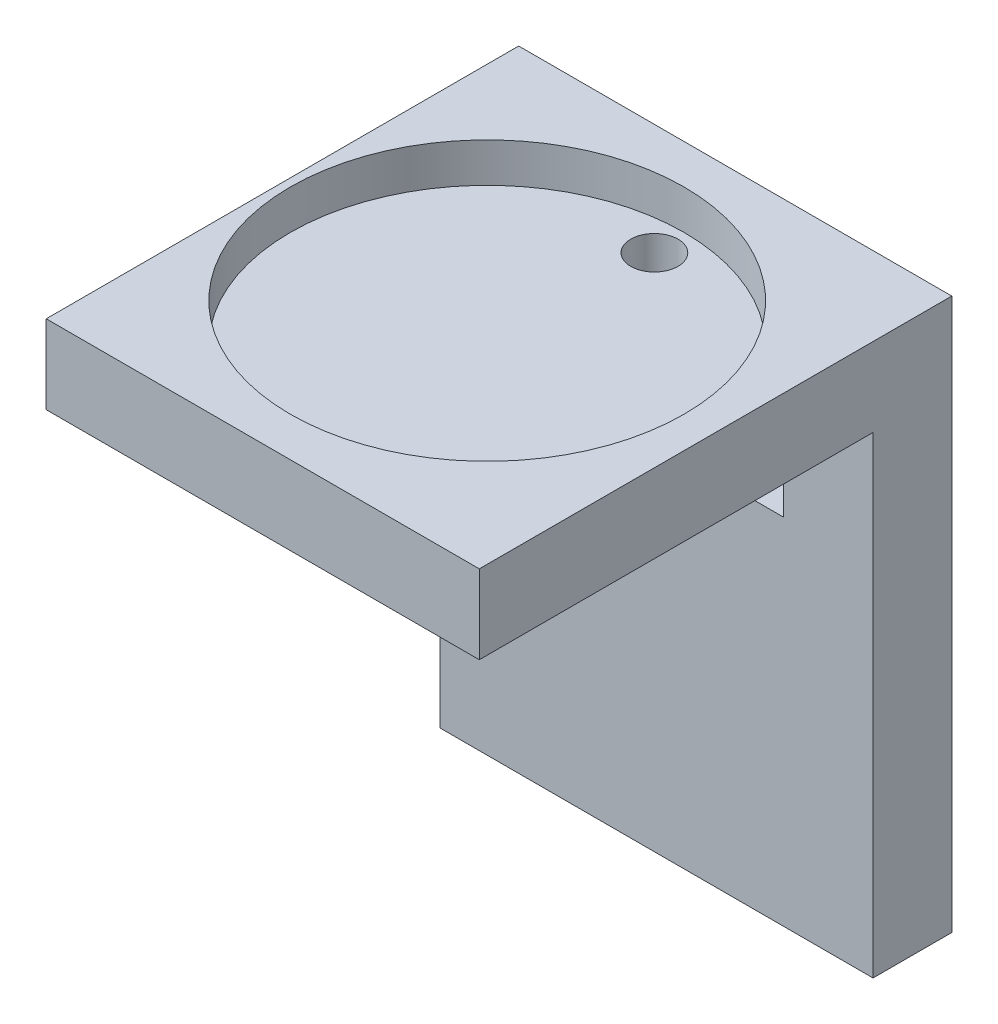
ISO-10303-21;
HEADER;
FILE_DESCRIPTION(('STEP AP214'),'2;1');
FILE_NAME('part.step','',(''),(''),'','','');
FILE_SCHEMA(('AUTOMOTIVE_DESIGN { 1 0 10303 214 1 1 1 1 }'));
ENDSEC;
DATA;
#1=APPLICATION_CONTEXT('core data for automotive mechanical design processes');
#2=APPLICATION_PROTOCOL_DEFINITION('international standard','automotive_design',2000,#1);
#3=PRODUCT_CONTEXT('',#1,'mechanical');
#4=PRODUCT('Part','Part','',(#3));
#5=PRODUCT_RELATED_PRODUCT_CATEGORY('part','',(#4));
#6=PRODUCT_DEFINITION_FORMATION('','',#4);
#7=PRODUCT_DEFINITION_CONTEXT('part definition',#1,'design');
#8=PRODUCT_DEFINITION('design','',#6,#7);
#9=PRODUCT_DEFINITION_SHAPE('','',#8);
#10=(LENGTH_UNIT() NAMED_UNIT(*) SI_UNIT(.MILLI.,.METRE.));
#11=(NAMED_UNIT(*) PLANE_ANGLE_UNIT() SI_UNIT($,.RADIAN.));
#12=(NAMED_UNIT(*) SI_UNIT($,.STERADIAN.) SOLID_ANGLE_UNIT());
#13=UNCERTAINTY_MEASURE_WITH_UNIT(LENGTH_MEASURE(1.E-05),#10,'distance_accuracy_value','');
#14=(GEOMETRIC_REPRESENTATION_CONTEXT(3) GLOBAL_UNCERTAINTY_ASSIGNED_CONTEXT((#13)) GLOBAL_UNIT_ASSIGNED_CONTEXT((#10,
#11,#12)) REPRESENTATION_CONTEXT('',''));
#15=CARTESIAN_POINT('',(0.,0.,0.));
#16=DIRECTION('',(0.,0.,1.));
#17=DIRECTION('',(1.,0.,0.));
#18=AXIS2_PLACEMENT_3D('',#15,#16,#17);
#19=CARTESIAN_POINT('',(0.,530.,0.));
#20=DIRECTION('',(0.,0.,-1.));
#21=DIRECTION('',(-1.,0.,0.));
#22=AXIS2_PLACEMENT_3D('',#19,#20,#21);
#23=PLANE('',#22);
#24=DIRECTION('',(-1.,0.,0.));
#25=VECTOR('',#24,1.);
#26=CARTESIAN_POINT('',(0.,280.,0.));
#27=LINE('',#26,#25);
#28=CARTESIAN_POINT('',(558.,280.,0.));
#29=VERTEX_POINT('',#28);
#30=CARTESIAN_POINT('',(448.,280.,0.));
#31=VERTEX_POINT('',#30);
#32=EDGE_CURVE('E173',#29,#31,#27,.T.);
#33=ORIENTED_EDGE('',*,*,#32,.T.);
#34=DIRECTION('',(0.,-1.,0.));
#35=VECTOR('',#34,1.);
#36=CARTESIAN_POINT('',(448.,0.,0.));
#37=LINE('',#36,#35);
#38=CARTESIAN_POINT('',(448.,260.,0.));
#39=VERTEX_POINT('',#38);
#40=EDGE_CURVE('E61',#31,#39,#37,.T.);
#41=ORIENTED_EDGE('',*,*,#40,.T.);
#42=DIRECTION('',(-1.,0.,0.));
#43=VECTOR('',#42,1.);
#44=CARTESIAN_POINT('',(9.99999999999982,260.,0.));
#45=LINE('',#44,#43);
#46=CARTESIAN_POINT('',(558.,260.,0.));
#47=VERTEX_POINT('',#46);
#48=EDGE_CURVE('E237',#47,#39,#45,.T.);
#49=ORIENTED_EDGE('',*,*,#48,.F.);
#50=DIRECTION('',(0.,1.,0.));
#51=VECTOR('',#50,1.);
#52=CARTESIAN_POINT('',(558.,0.,0.));
#53=LINE('',#52,#51);
#54=EDGE_CURVE('E463',#47,#29,#53,.T.);
#55=ORIENTED_EDGE('',*,*,#54,.T.);
#56=EDGE_LOOP('',(#33,#41,#49,#55));
#57=FACE_BOUND('',#56,.T.);
#58=ADVANCED_FACE('F38',(#57),#23,.F.);
#59=CARTESIAN_POINT('',(0.,530.,-120.));
#60=DIRECTION('',(0.,0.,1.));
#61=DIRECTION('',(1.,0.,0.));
#62=AXIS2_PLACEMENT_3D('',#59,#60,#61);
#63=PLANE('',#62);
#64=DIRECTION('',(0.,1.,0.));
#65=VECTOR('',#64,1.);
#66=CARTESIAN_POINT('',(535.198613037107,530.,-120.));
#67=LINE('',#66,#65);
#68=CARTESIAN_POINT('',(535.198613037107,230.,-120.));
#69=VERTEX_POINT('',#68);
#70=CARTESIAN_POINT('',(535.198613037107,260.,-120.));
#71=VERTEX_POINT('',#70);
#72=EDGE_CURVE('E210',#69,#71,#67,.T.);
#73=ORIENTED_EDGE('',*,*,#72,.T.);
#74=DIRECTION('',(-1.,0.,0.));
#75=VECTOR('',#74,1.);
#76=CARTESIAN_POINT('',(0.,260.,-120.));
#77=LINE('',#76,#75);
#78=CARTESIAN_POINT('',(515.198613037107,260.,-120.));
#79=VERTEX_POINT('',#78);
#80=EDGE_CURVE('E214',#71,#79,#77,.T.);
#81=ORIENTED_EDGE('',*,*,#80,.T.);
#82=DIRECTION('',(0.,-1.,0.));
#83=VECTOR('',#82,1.);
#84=CARTESIAN_POINT('',(515.198613037106,530.000000000002,-120.));
#85=LINE('',#84,#83);
#86=CARTESIAN_POINT('',(515.198613037107,230.,-120.));
#87=VERTEX_POINT('',#86);
#88=EDGE_CURVE('E194',#79,#87,#85,.T.);
#89=ORIENTED_EDGE('',*,*,#88,.T.);
#90=DIRECTION('',(1.,0.,0.));
#91=VECTOR('',#90,1.);
#92=CARTESIAN_POINT('',(0.,230.,-120.));
#93=LINE('',#92,#91);
#94=EDGE_CURVE('E206',#87,#69,#93,.T.);
#95=ORIENTED_EDGE('',*,*,#94,.T.);
#96=EDGE_LOOP('',(#73,#81,#89,#95));
#97=FACE_BOUND('',#96,.T.);
#98=DIRECTION('',(0.,-1.,0.));
#99=VECTOR('',#98,1.);
#100=CARTESIAN_POINT('',(558.,530.,-120.));
#101=LINE('',#100,#99);
#102=CARTESIAN_POINT('',(558.,280.,-120.));
#103=VERTEX_POINT('',#102);
#104=CARTESIAN_POINT('',(558.,140.,-120.));
#105=VERTEX_POINT('',#104);
#106=EDGE_CURVE('E142',#103,#105,#101,.T.);
#107=ORIENTED_EDGE('',*,*,#106,.T.);
#108=DIRECTION('',(-1.,0.,0.));
#109=VECTOR('',#108,1.);
#110=CARTESIAN_POINT('',(448.,140.,-120.));
#111=LINE('',#110,#109);
#112=CARTESIAN_POINT('',(448.,140.,-120.));
#113=VERTEX_POINT('',#112);
#114=EDGE_CURVE('E129',#105,#113,#111,.T.);
#115=ORIENTED_EDGE('',*,*,#114,.T.);
#116=DIRECTION('',(0.,1.,0.));
#117=VECTOR('',#116,1.);
#118=CARTESIAN_POINT('',(448.,530.,-120.));
#119=LINE('',#118,#117);
#120=CARTESIAN_POINT('',(448.,280.,-120.));
#121=VERTEX_POINT('',#120);
#122=EDGE_CURVE('E168',#113,#121,#119,.T.);
#123=ORIENTED_EDGE('',*,*,#122,.T.);
#124=DIRECTION('',(1.,0.,0.));
#125=VECTOR('',#124,1.);
#126=CARTESIAN_POINT('',(0.,280.,-120.));
#127=LINE('',#126,#125);
#128=EDGE_CURVE('E151',#121,#103,#127,.T.);
#129=ORIENTED_EDGE('',*,*,#128,.T.);
#130=EDGE_LOOP('',(#107,#115,#123,#129));
#131=FACE_BOUND('',#130,.T.);
#132=ADVANCED_FACE('F149',(#97,#131),#63,.F.);
#133=CARTESIAN_POINT('',(9.99999999999982,260.,-100.));
#134=DIRECTION('',(0.,1.,0.));
#135=DIRECTION('',(0.,0.,1.));
#136=AXIS2_PLACEMENT_3D('',#133,#134,#135);
#137=PLANE('',#136);
#138=ORIENTED_EDGE('',*,*,#48,.T.);
#139=DIRECTION('',(0.,0.,-1.));
#140=VECTOR('',#139,1.);
#141=CARTESIAN_POINT('',(448.,260.,-100.));
#142=LINE('',#141,#140);
#143=CARTESIAN_POINT('',(448.,260.,-100.));
#144=VERTEX_POINT('',#143);
#145=EDGE_CURVE('E159',#39,#144,#142,.T.);
#146=ORIENTED_EDGE('',*,*,#145,.T.);
#147=DIRECTION('',(-1.,0.,0.));
#148=VECTOR('',#147,1.);
#149=CARTESIAN_POINT('',(9.99999999999982,260.,-100.));
#150=LINE('',#149,#148);
#151=CARTESIAN_POINT('',(494.975382206255,260.,-100.));
#152=VERTEX_POINT('',#151);
#153=EDGE_CURVE('E243',#152,#144,#150,.T.);
#154=ORIENTED_EDGE('',*,*,#153,.F.);
#155=CARTESIAN_POINT('',(500.713288842155,260.,-101.753974754009));
#156=DIRECTION('',(0.,1.,0.));
#157=DIRECTION('',(0.,0.,1.));
#158=AXIS2_PLACEMENT_3D('',#155,#156,#157);
#159=CIRCLE('',#158,6.00000000000001);
#160=CARTESIAN_POINT('',(506.451195478054,260.,-100.));
#161=VERTEX_POINT('',#160);
#162=EDGE_CURVE('E225',#152,#161,#159,.T.);
#163=ORIENTED_EDGE('',*,*,#162,.T.);
#164=CARTESIAN_POINT('',(515.198613037107,260.,-100.));
#165=VERTEX_POINT('',#164);
#166=EDGE_CURVE('E242',#165,#161,#150,.T.);
#167=ORIENTED_EDGE('',*,*,#166,.F.);
#168=DIRECTION('',(0.,0.,1.));
#169=VECTOR('',#168,1.);
#170=CARTESIAN_POINT('',(515.198613037107,260.,-180.));
#171=LINE('',#170,#169);
#172=EDGE_CURVE('E189',#79,#165,#171,.T.);
#173=ORIENTED_EDGE('',*,*,#172,.F.);
#174=ORIENTED_EDGE('',*,*,#80,.F.);
#175=DIRECTION('',(0.,0.,1.));
#176=VECTOR('',#175,1.);
#177=CARTESIAN_POINT('',(535.198613037107,260.,-180.));
#178=LINE('',#177,#176);
#179=CARTESIAN_POINT('',(535.198613037107,260.,-100.));
#180=VERTEX_POINT('',#179);
#181=EDGE_CURVE('E190',#71,#180,#178,.T.);
#182=ORIENTED_EDGE('',*,*,#181,.T.);
#183=CARTESIAN_POINT('',(558.,260.,-100.));
#184=VERTEX_POINT('',#183);
#185=EDGE_CURVE('E238',#184,#180,#150,.T.);
#186=ORIENTED_EDGE('',*,*,#185,.F.);
#187=DIRECTION('',(0.,0.,1.));
#188=VECTOR('',#187,1.);
#189=CARTESIAN_POINT('',(558.,260.,-100.));
#190=LINE('',#189,#188);
#191=EDGE_CURVE('E154',#184,#47,#190,.T.);
#192=ORIENTED_EDGE('',*,*,#191,.T.);
#193=EDGE_LOOP('',(#138,#146,#154,#163,#167,#173,#174,#182,#186,#192));
#194=FACE_BOUND('',#193,.T.);
#195=ADVANCED_FACE('F265',(#194),#137,.F.);
#196=CARTESIAN_POINT('',(0.,0.,-100.));
#197=DIRECTION('',(0.,0.,-1.));
#198=DIRECTION('',(-1.,0.,0.));
#199=AXIS2_PLACEMENT_3D('',#196,#197,#198);
#200=PLANE('',#199);
#201=DIRECTION('',(0.,-1.,0.));
#202=VECTOR('',#201,1.);
#203=CARTESIAN_POINT('',(448.,0.,-100.));
#204=LINE('',#203,#202);
#205=CARTESIAN_POINT('',(448.,140.,-100.));
#206=VERTEX_POINT('',#205);
#207=EDGE_CURVE('E153',#144,#206,#204,.T.);
#208=ORIENTED_EDGE('',*,*,#207,.T.);
#209=DIRECTION('',(1.,0.,0.));
#210=VECTOR('',#209,1.);
#211=CARTESIAN_POINT('',(0.,140.,-100.));
#212=LINE('',#211,#210);
#213=CARTESIAN_POINT('',(558.,140.,-100.));
#214=VERTEX_POINT('',#213);
#215=EDGE_CURVE('E53',#206,#214,#212,.T.);
#216=ORIENTED_EDGE('',*,*,#215,.T.);
#217=DIRECTION('',(0.,1.,0.));
#218=VECTOR('',#217,1.);
#219=CARTESIAN_POINT('',(558.,0.,-100.));
#220=LINE('',#219,#218);
#221=EDGE_CURVE('E145',#214,#184,#220,.T.);
#222=ORIENTED_EDGE('',*,*,#221,.T.);
#223=ORIENTED_EDGE('',*,*,#185,.T.);
#224=DIRECTION('',(0.,1.,0.));
#225=VECTOR('',#224,1.);
#226=CARTESIAN_POINT('',(535.198613037107,260.,-100.));
#227=LINE('',#226,#225);
#228=CARTESIAN_POINT('',(535.198613037107,230.,-100.));
#229=VERTEX_POINT('',#228);
#230=EDGE_CURVE('E185',#229,#180,#227,.T.);
#231=ORIENTED_EDGE('',*,*,#230,.F.);
#232=DIRECTION('',(1.,0.,0.));
#233=VECTOR('',#232,1.);
#234=CARTESIAN_POINT('',(515.198613037107,230.,-100.));
#235=LINE('',#234,#233);
#236=CARTESIAN_POINT('',(515.198613037107,230.,-100.));
#237=VERTEX_POINT('',#236);
#238=EDGE_CURVE('E181',#237,#229,#235,.T.);
#239=ORIENTED_EDGE('',*,*,#238,.F.);
#240=DIRECTION('',(0.,-1.,0.));
#241=VECTOR('',#240,1.);
#242=CARTESIAN_POINT('',(515.198613037107,260.,-100.));
#243=LINE('',#242,#241);
#244=EDGE_CURVE('E177',#165,#237,#243,.T.);
#245=ORIENTED_EDGE('',*,*,#244,.F.);
#246=ORIENTED_EDGE('',*,*,#166,.T.);
#247=DIRECTION('',(0.,1.,0.));
#248=VECTOR('',#247,1.);
#249=CARTESIAN_POINT('',(506.451195478054,270.,-100.));
#250=LINE('',#249,#248);
#251=CARTESIAN_POINT('',(506.451195478054,240.,-100.));
#252=VERTEX_POINT('',#251);
#253=EDGE_CURVE('E46',#161,#252,#250,.F.);
#254=ORIENTED_EDGE('',*,*,#253,.T.);
#255=CARTESIAN_POINT('',(470.082886516547,254.82958842919,-100.));
#256=CARTESIAN_POINT('',(471.150827165503,254.188963034364,-100.));
#257=CARTESIAN_POINT('',(472.21880894333,253.548406167313,-100.));
#258=CARTESIAN_POINT('',(474.354919189177,252.267513422567,-100.));
#259=CARTESIAN_POINT('',(475.423047658528,251.627177547093,-100.));
#260=CARTESIAN_POINT('',(477.559776910704,250.346654206762,-100.));
#261=CARTESIAN_POINT('',(478.628377743772,249.706466825732,-100.));
#262=CARTESIAN_POINT('',(480.76586152743,248.426586276209,-100.));
#263=CARTESIAN_POINT('',(481.834744475238,247.78689310307,-100.));
#264=CARTESIAN_POINT('',(483.969561807604,246.510332744626,-100.));
#265=CARTESIAN_POINT('',(485.03549469778,245.873463061548,-100.));
#266=CARTESIAN_POINT('',(486.63504477002,244.919213656534,-100.));
#267=CARTESIAN_POINT('',(487.168344407288,244.601301721497,-100.));
#268=CARTESIAN_POINT('',(488.235245008858,243.965987105198,-100.));
#269=CARTESIAN_POINT('',(488.768845972309,243.648584422508,-100.));
#270=CARTESIAN_POINT('',(489.836396248373,243.014582017211,-100.));
#271=CARTESIAN_POINT('',(490.370345482029,242.697982161675,-100.));
#272=CARTESIAN_POINT('',(491.438930317626,242.065928151688,-100.));
#273=CARTESIAN_POINT('',(491.973565926929,241.750474009667,-100.));
#274=CARTESIAN_POINT('',(492.776368148775,241.278767713209,-100.));
#275=CARTESIAN_POINT('',(493.044103628431,241.121782021229,-100.));
#276=CARTESIAN_POINT('',(493.579965306285,240.808479138551,-100.));
#277=CARTESIAN_POINT('',(493.848091504016,240.652161947056,-100.));
#278=CARTESIAN_POINT('',(494.384877973697,240.340457666179,-100.));
#279=CARTESIAN_POINT('',(494.653538236201,240.185070560539,-100.));
#280=CARTESIAN_POINT('',(495.191626439735,239.875632152413,-100.));
#281=CARTESIAN_POINT('',(495.46105437563,239.721580841018,-100.));
#282=CARTESIAN_POINT('',(495.838655717135,239.507573769449,-100.));
#283=CARTESIAN_POINT('',(495.946341209331,239.446757259471,-100.));
#284=CARTESIAN_POINT('',(496.161935552821,239.325521344201,-100.));
#285=CARTESIAN_POINT('',(496.26984440413,239.265101938936,-100.));
#286=CARTESIAN_POINT('',(496.593989033208,239.084548435639,-100.));
#287=CARTESIAN_POINT('',(496.810624087339,238.965129739924,-100.));
#288=CARTESIAN_POINT('',(497.24593039935,238.728940465418,-100.));
#289=CARTESIAN_POINT('',(497.464604962554,238.612175931538,-100.));
#290=CARTESIAN_POINT('',(497.794490083839,238.440661200653,-100.));
#291=CARTESIAN_POINT('',(497.90475656479,238.384098630969,-100.));
#292=CARTESIAN_POINT('',(498.126102736589,238.272591077835,-100.));
#293=CARTESIAN_POINT('',(498.237182402297,238.217646044637,-100.));
#294=CARTESIAN_POINT('',(498.471805397209,238.104418355631,-100.));
#295=CARTESIAN_POINT('',(498.595461886463,238.046368808238,-100.));
#296=CARTESIAN_POINT('',(498.844467410048,237.9340419729,-100.));
#297=CARTESIAN_POINT('',(498.969816135441,237.879764007234,-100.));
#298=CARTESIAN_POINT('',(499.22265373397,237.776785986089,-100.));
#299=CARTESIAN_POINT('',(499.350140139133,237.728079946212,-100.));
#300=CARTESIAN_POINT('',(499.607998790716,237.63892047012,-100.));
#301=CARTESIAN_POINT('',(499.738369658867,237.598463182978,-100.));
#302=CARTESIAN_POINT('',(499.961663141247,237.540358839534,-100.));
#303=CARTESIAN_POINT('',(500.053743567023,237.519524604627,-100.));
#304=CARTESIAN_POINT('',(500.239276703562,237.485251598741,-100.));
#305=CARTESIAN_POINT('',(500.332728909442,237.471810173601,-100.));
#306=CARTESIAN_POINT('',(500.519918925762,237.45367508533,-100.));
#307=CARTESIAN_POINT('',(500.613651328918,237.448927440505,-100.));
#308=CARTESIAN_POINT('',(500.801135418036,237.448545750549,-100.));
#309=CARTESIAN_POINT('',(500.894887104687,237.452912125432,-100.));
#310=CARTESIAN_POINT('',(501.107946086848,237.472742519534,-100.));
#311=CARTESIAN_POINT('',(501.226991249846,237.490993040094,-100.));
#312=CARTESIAN_POINT('',(501.462746032214,237.538953661252,-100.));
#313=CARTESIAN_POINT('',(501.57945337977,237.568674389154,-100.));
#314=CARTESIAN_POINT('',(501.811845954807,237.636864304386,-100.));
#315=CARTESIAN_POINT('',(501.927498954385,237.675440649224,-100.));
#316=CARTESIAN_POINT('',(502.099294838219,237.737779538911,-100.));
#317=CARTESIAN_POINT('',(502.156273210744,237.759302222941,-100.));
#318=CARTESIAN_POINT('',(502.269736754705,237.803607614574,-100.));
#319=CARTESIAN_POINT('',(502.326221944195,237.826390275826,-100.));
#320=CARTESIAN_POINT('',(502.506176661985,237.900925635856,-100.));
#321=CARTESIAN_POINT('',(502.628814810907,237.954682607697,-100.));
#322=CARTESIAN_POINT('',(502.872519559516,238.065662338144,-100.));
#323=CARTESIAN_POINT('',(502.993585859462,238.122885746321,-100.));
#324=CARTESIAN_POINT('',(503.23459156437,238.239814982727,-100.));
#325=CARTESIAN_POINT('',(503.354530311786,238.299522161147,-100.));
#326=CARTESIAN_POINT('',(503.593503068825,238.420724262748,-100.));
#327=CARTESIAN_POINT('',(503.712537042327,238.482219256835,-100.));
#328=CARTESIAN_POINT('',(504.068999613951,238.668876408986,-100.));
#329=CARTESIAN_POINT('',(504.305391884622,238.796013924936,-100.));
#330=CARTESIAN_POINT('',(504.776403705392,239.053321463438,-100.));
#331=CARTESIAN_POINT('',(505.011023821115,239.18349045913,-100.));
#332=CARTESIAN_POINT('',(505.478115575371,239.445228450088,-100.));
#333=CARTESIAN_POINT('',(505.710592127302,239.576788687306,-100.));
#334=CARTESIAN_POINT('',(506.174809945667,239.84124308255,-100.));
#335=CARTESIAN_POINT('',(506.406551147585,239.974137353583,-100.));
#336=CARTESIAN_POINT('',(506.869245637192,240.240716431173,-100.));
#337=CARTESIAN_POINT('',(507.100199504652,240.374400232214,-100.));
#338=CARTESIAN_POINT('',(507.561704034796,240.642446746176,-100.));
#339=CARTESIAN_POINT('',(507.792254708508,240.776809440125,-100.));
#340=CARTESIAN_POINT('',(508.45683033425,241.165098416045,-100.));
#341=CARTESIAN_POINT('',(508.890477137855,241.419671708023,-100.));
#342=CARTESIAN_POINT('',(509.757116801061,241.929929411803,-100.));
#343=CARTESIAN_POINT('',(510.190109659356,242.18561382582,-100.));
#344=CARTESIAN_POINT('',(511.055661838567,242.697730051981,-100.));
#345=CARTESIAN_POINT('',(511.488221152867,242.954161875301,-100.));
#346=CARTESIAN_POINT('',(512.353031308484,243.46754524495,-100.));
#347=CARTESIAN_POINT('',(512.785282149707,243.724496791435,-100.));
#348=CARTESIAN_POINT('',(514.082131436077,244.496161539199,-100.));
#349=CARTESIAN_POINT('',(514.946398713682,245.011431210117,-100.));
#350=CARTESIAN_POINT('',(516.674427093231,246.042806388491,-100.));
#351=CARTESIAN_POINT('',(517.538188198159,246.558911890951,-100.));
#352=CARTESIAN_POINT('',(519.266447815617,247.592287135202,-100.));
#353=CARTESIAN_POINT('',(520.130945938314,248.109557528922,-100.));
#354=CARTESIAN_POINT('',(521.859730995239,249.144454967302,-100.));
#355=CARTESIAN_POINT('',(522.724017929042,249.662082012672,-100.));
#356=CARTESIAN_POINT('',(524.451991515694,250.697313941555,-100.));
#357=CARTESIAN_POINT('',(525.315678246254,251.214918695365,-100.));
#358=CARTESIAN_POINT('',(527.042939092308,252.250311953573,-100.));
#359=CARTESIAN_POINT('',(527.906513208035,252.768100457582,-100.));
#360=CARTESIAN_POINT('',(528.770050840775,253.285949765914,-100.));
#361=B_SPLINE_CURVE_WITH_KNOTS('',3,(#255,#256,#257,#258,#259,#260,#261,#262,#263,#264,#265,
#266,#267,#268,#269,#270,#271,#272,#273,#274,#275,#276,#277,#278,#279,#280,#281,#282,#283,#284,
#285,#286,#287,#288,#289,#290,#291,#292,#293,#294,#295,#296,#297,#298,#299,#300,#301,#302,#303,
#304,#305,#306,#307,#308,#309,#310,#311,#312,#313,#314,#315,#316,#317,#318,#319,#320,#321,#322,
#323,#324,#325,#326,#327,#328,#329,#330,#331,#332,#333,#334,#335,#336,#337,#338,#339,#340,#341,
#342,#343,#344,#345,#346,#347,#348,#349,#350,#351,#352,#353,#354,#355,#356,#357,#358,#359,#360),
.UNSPECIFIED.,.F.,.F.,(4,2,2,2,2,2,2,2,2,2,2,2,2,2,2,2,2,2,2,2,2,2,2,2,2,2,2,2,2,2,2,2,2,2,2,2,
2,2,2,2,2,2,2,2,2,2,2,2,2,2,2,2,4),(0.,3.73605183437221,7.47214015472863,11.209214930185,
14.9462541397402,18.6713497963927,20.5339522422565,22.3965494543686,24.2588149672757,
26.1211006237646,27.0521967251417,27.9832917138767,28.9143703779098,29.8454428278924,
30.2164587356586,30.5874746669757,31.3295714042703,32.0732164622807,32.4449892552989,
32.8167506025014,33.2265210912165,33.636217756322,34.0454701809204,34.4545311065282,
34.7375178213157,35.0204028720381,35.3015253893707,35.5826608623312,35.9432132243309,
36.3041004481055,36.6696091370321,36.852322349018,37.0350288439906,37.4366467105055,
37.8383400700766,38.2402547214822,38.6421853349402,39.4473754698245,40.2522967179066,
41.0536516930894,41.855075133416,42.6556354685074,43.456173553037,44.9647173557676,
46.4732641658086,47.9818336527851,49.4904035981449,52.5090358375459,55.5276500949033,
58.5499555252835,61.5722669992271,64.5929995075574,67.6137256596593),.UNSPECIFIED.);
#362=CARTESIAN_POINT('',(494.975382206255,240.,-100.));
#363=VERTEX_POINT('',#362);
#364=EDGE_CURVE('E241',#252,#363,#361,.F.);
#365=ORIENTED_EDGE('',*,*,#364,.T.);
#366=DIRECTION('',(0.,1.,0.));
#367=VECTOR('',#366,1.);
#368=CARTESIAN_POINT('',(494.975382206255,270.,-100.));
#369=LINE('',#368,#367);
#370=EDGE_CURVE('E11',#363,#152,#369,.T.);
#371=ORIENTED_EDGE('',*,*,#370,.T.);
#372=ORIENTED_EDGE('',*,*,#153,.T.);
#373=EDGE_LOOP('',(#208,#216,#222,#223,#231,#239,#245,#246,#254,#365,#371,#372));
#374=FACE_BOUND('',#373,.T.);
#375=ADVANCED_FACE('F259',(#374),#200,.F.);
#376=CARTESIAN_POINT('',(340.,280.,-100.));
#377=DIRECTION('',(0.,-1.,0.));
#378=DIRECTION('',(0.,0.,-1.));
#379=AXIS2_PLACEMENT_3D('',#376,#377,#378);
#380=PLANE('',#379);
#381=CARTESIAN_POINT('',(500.,280.,-60.));
#382=DIRECTION('',(0.,-1.,0.));
#383=DIRECTION('',(0.,0.,-1.));
#384=AXIS2_PLACEMENT_3D('',#381,#382,#383);
#385=CIRCLE('',#384,50.);
#386=CARTESIAN_POINT('',(500.,280.,-110.));
#387=VERTEX_POINT('',#386);
#388=EDGE_CURVE('E233',#387,#387,#385,.T.);
#389=ORIENTED_EDGE('',*,*,#388,.T.);
#390=EDGE_LOOP('',(#389));
#391=FACE_BOUND('',#390,.T.);
#392=ORIENTED_EDGE('',*,*,#128,.F.);
#393=DIRECTION('',(0.,0.,-1.));
#394=VECTOR('',#393,1.);
#395=CARTESIAN_POINT('',(448.,280.,0.));
#396=LINE('',#395,#394);
#397=EDGE_CURVE('E459',#31,#121,#396,.T.);
#398=ORIENTED_EDGE('',*,*,#397,.F.);
#399=ORIENTED_EDGE('',*,*,#32,.F.);
#400=DIRECTION('',(0.,0.,-1.));
#401=VECTOR('',#400,1.);
#402=CARTESIAN_POINT('',(558.,280.,0.));
#403=LINE('',#402,#401);
#404=EDGE_CURVE('E460',#29,#103,#403,.T.);
#405=ORIENTED_EDGE('',*,*,#404,.T.);
#406=EDGE_LOOP('',(#392,#398,#399,#405));
#407=FACE_BOUND('',#406,.T.);
#408=ADVANCED_FACE('F264',(#391,#407),#380,.F.);
#409=CARTESIAN_POINT('',(500.,270.,-60.));
#410=DIRECTION('',(0.,1.,0.));
#411=DIRECTION('',(0.,0.,1.));
#412=AXIS2_PLACEMENT_3D('',#409,#410,#411);
#413=CYLINDRICAL_SURFACE('',#412,50.);
#414=CARTESIAN_POINT('',(500.,270.,-60.));
#415=DIRECTION('',(0.,1.,0.));
#416=DIRECTION('',(0.,0.,1.));
#417=AXIS2_PLACEMENT_3D('',#414,#415,#416);
#418=CIRCLE('',#417,50.);
#419=CARTESIAN_POINT('',(500.,270.,-9.99999999999997));
#420=VERTEX_POINT('',#419);
#421=EDGE_CURVE('E229',#420,#420,#418,.T.);
#422=ORIENTED_EDGE('',*,*,#421,.F.);
#423=EDGE_LOOP('',(#422));
#424=FACE_BOUND('',#423,.T.);
#425=ORIENTED_EDGE('',*,*,#388,.F.);
#426=EDGE_LOOP('',(#425));
#427=FACE_BOUND('',#426,.T.);
#428=ADVANCED_FACE('F316',(#424,#427),#413,.F.);
#429=CARTESIAN_POINT('',(500.,270.,-60.));
#430=DIRECTION('',(0.,1.,0.));
#431=DIRECTION('',(0.,0.,1.));
#432=AXIS2_PLACEMENT_3D('',#429,#430,#431);
#433=PLANE('',#432);
#434=CARTESIAN_POINT('',(500.713288842155,270.,-101.753974754009));
#435=DIRECTION('',(0.,1.,0.));
#436=DIRECTION('',(0.,0.,1.));
#437=AXIS2_PLACEMENT_3D('',#434,#435,#436);
#438=CIRCLE('',#437,6.00000000000001);
#439=CARTESIAN_POINT('',(500.713288842155,270.,-95.7539747540093));
#440=VERTEX_POINT('',#439);
#441=EDGE_CURVE('E218',#440,#440,#438,.T.);
#442=ORIENTED_EDGE('',*,*,#441,.F.);
#443=EDGE_LOOP('',(#442));
#444=FACE_BOUND('',#443,.T.);
#445=ORIENTED_EDGE('',*,*,#421,.T.);
#446=EDGE_LOOP('',(#445));
#447=FACE_BOUND('',#446,.T.);
#448=ADVANCED_FACE('F311',(#444,#447),#433,.T.);
#449=CARTESIAN_POINT('',(500.713288842155,270.,-101.753974754009));
#450=DIRECTION('',(0.,1.,0.));
#451=DIRECTION('',(0.,0.,1.));
#452=AXIS2_PLACEMENT_3D('',#449,#450,#451);
#453=CYLINDRICAL_SURFACE('',#452,6.00000000000001);
#454=ORIENTED_EDGE('',*,*,#441,.T.);
#455=EDGE_LOOP('',(#454));
#456=FACE_BOUND('',#455,.T.);
#457=CARTESIAN_POINT('',(500.713288842155,240.,-101.753974754009));
#458=DIRECTION('',(0.,1.,0.));
#459=DIRECTION('',(0.,0.,1.));
#460=AXIS2_PLACEMENT_3D('',#457,#458,#459);
#461=CIRCLE('',#460,6.00000000000001);
#462=EDGE_CURVE('E222',#252,#363,#461,.T.);
#463=ORIENTED_EDGE('',*,*,#462,.F.);
#464=ORIENTED_EDGE('',*,*,#253,.F.);
#465=ORIENTED_EDGE('',*,*,#162,.F.);
#466=ORIENTED_EDGE('',*,*,#370,.F.);
#467=EDGE_LOOP('',(#463,#464,#465,#466));
#468=FACE_BOUND('',#467,.T.);
#469=ADVANCED_FACE('F297',(#456,#468),#453,.F.);
#470=CARTESIAN_POINT('',(500.713288842155,240.,-101.753974754009));
#471=DIRECTION('',(0.,1.,0.));
#472=DIRECTION('',(0.,0.,1.));
#473=AXIS2_PLACEMENT_3D('',#470,#471,#472);
#474=CONICAL_SURFACE('',#473,6.00000000000001,1.02974425867666);
#475=CARTESIAN_POINT('',(500.713288842155,236.394836285835,-101.753974754009));
#476=VERTEX_POINT('',#475);
#477=VERTEX_LOOP('',#476);
#478=FACE_BOUND('',#477,.T.);
#479=ORIENTED_EDGE('',*,*,#462,.T.);
#480=ORIENTED_EDGE('',*,*,#364,.F.);
#481=EDGE_LOOP('',(#479,#480));
#482=FACE_BOUND('',#481,.T.);
#483=ADVANCED_FACE('F255',(#478,#482),#474,.F.);
#484=CARTESIAN_POINT('',(535.198613037107,260.,-180.));
#485=DIRECTION('',(1.,0.,0.));
#486=DIRECTION('',(0.,0.,-1.));
#487=AXIS2_PLACEMENT_3D('',#484,#485,#486);
#488=PLANE('',#487);
#489=DIRECTION('',(0.,0.,1.));
#490=VECTOR('',#489,1.);
#491=CARTESIAN_POINT('',(535.198613037107,230.,-180.));
#492=LINE('',#491,#490);
#493=EDGE_CURVE('E195',#69,#229,#492,.T.);
#494=ORIENTED_EDGE('',*,*,#493,.T.);
#495=ORIENTED_EDGE('',*,*,#230,.T.);
#496=ORIENTED_EDGE('',*,*,#181,.F.);
#497=ORIENTED_EDGE('',*,*,#72,.F.);
#498=EDGE_LOOP('',(#494,#495,#496,#497));
#499=FACE_BOUND('',#498,.T.);
#500=ADVANCED_FACE('F281',(#499),#488,.F.);
#501=CARTESIAN_POINT('',(515.198613037107,230.,-180.));
#502=DIRECTION('',(0.,-1.,0.));
#503=DIRECTION('',(0.,0.,-1.));
#504=AXIS2_PLACEMENT_3D('',#501,#502,#503);
#505=PLANE('',#504);
#506=DIRECTION('',(0.,0.,1.));
#507=VECTOR('',#506,1.);
#508=CARTESIAN_POINT('',(515.198613037107,230.,-180.));
#509=LINE('',#508,#507);
#510=EDGE_CURVE('E198',#87,#237,#509,.T.);
#511=ORIENTED_EDGE('',*,*,#510,.T.);
#512=ORIENTED_EDGE('',*,*,#238,.T.);
#513=ORIENTED_EDGE('',*,*,#493,.F.);
#514=ORIENTED_EDGE('',*,*,#94,.F.);
#515=EDGE_LOOP('',(#511,#512,#513,#514));
#516=FACE_BOUND('',#515,.T.);
#517=ADVANCED_FACE('F283',(#516),#505,.F.);
#518=CARTESIAN_POINT('',(515.198613037107,260.,-180.));
#519=DIRECTION('',(-1.,0.,0.));
#520=DIRECTION('',(0.,-1.,0.));
#521=AXIS2_PLACEMENT_3D('',#518,#519,#520);
#522=PLANE('',#521);
#523=ORIENTED_EDGE('',*,*,#172,.T.);
#524=ORIENTED_EDGE('',*,*,#244,.T.);
#525=ORIENTED_EDGE('',*,*,#510,.F.);
#526=ORIENTED_EDGE('',*,*,#88,.F.);
#527=EDGE_LOOP('',(#523,#524,#525,#526));
#528=FACE_BOUND('',#527,.T.);
#529=ADVANCED_FACE('F291',(#528),#522,.F.);
#530=CARTESIAN_POINT('',(558.,0.,0.));
#531=DIRECTION('',(-1.,0.,0.));
#532=DIRECTION('',(0.,0.,1.));
#533=AXIS2_PLACEMENT_3D('',#530,#531,#532);
#534=PLANE('',#533);
#535=ORIENTED_EDGE('',*,*,#221,.F.);
#536=DIRECTION('',(0.,0.,1.));
#537=VECTOR('',#536,1.);
#538=CARTESIAN_POINT('',(558.,140.,-120.));
#539=LINE('',#538,#537);
#540=EDGE_CURVE('E132',#105,#214,#539,.T.);
#541=ORIENTED_EDGE('',*,*,#540,.F.);
#542=ORIENTED_EDGE('',*,*,#106,.F.);
#543=ORIENTED_EDGE('',*,*,#404,.F.);
#544=ORIENTED_EDGE('',*,*,#54,.F.);
#545=ORIENTED_EDGE('',*,*,#191,.F.);
#546=EDGE_LOOP('',(#535,#541,#542,#543,#544,#545));
#547=FACE_BOUND('',#546,.T.);
#548=ADVANCED_FACE('F141',(#547),#534,.F.);
#549=CARTESIAN_POINT('',(448.,0.,0.));
#550=DIRECTION('',(1.,0.,0.));
#551=DIRECTION('',(0.,0.,-1.));
#552=AXIS2_PLACEMENT_3D('',#549,#550,#551);
#553=PLANE('',#552);
#554=ORIENTED_EDGE('',*,*,#122,.F.);
#555=DIRECTION('',(0.,0.,1.));
#556=VECTOR('',#555,1.);
#557=CARTESIAN_POINT('',(448.,140.,-120.));
#558=LINE('',#557,#556);
#559=EDGE_CURVE('E133',#113,#206,#558,.T.);
#560=ORIENTED_EDGE('',*,*,#559,.T.);
#561=ORIENTED_EDGE('',*,*,#207,.F.);
#562=ORIENTED_EDGE('',*,*,#145,.F.);
#563=ORIENTED_EDGE('',*,*,#40,.F.);
#564=ORIENTED_EDGE('',*,*,#397,.T.);
#565=EDGE_LOOP('',(#554,#560,#561,#562,#563,#564));
#566=FACE_BOUND('',#565,.T.);
#567=ADVANCED_FACE('F325',(#566),#553,.F.);
#568=CARTESIAN_POINT('',(448.,140.,-120.));
#569=DIRECTION('',(0.,1.,0.));
#570=DIRECTION('',(0.,0.,1.));
#571=AXIS2_PLACEMENT_3D('',#568,#569,#570);
#572=PLANE('',#571);
#573=ORIENTED_EDGE('',*,*,#559,.F.);
#574=ORIENTED_EDGE('',*,*,#114,.F.);
#575=ORIENTED_EDGE('',*,*,#540,.T.);
#576=ORIENTED_EDGE('',*,*,#215,.F.);
#577=EDGE_LOOP('',(#573,#574,#575,#576));
#578=FACE_BOUND('',#577,.T.);
#579=ADVANCED_FACE('F131',(#578),#572,.F.);
#580=CLOSED_SHELL('',(#58,#132,#195,#375,#408,#428,#448,#469,#483,#500,#517,#529,#548,#567,#579));
#581=MANIFOLD_SOLID_BREP('B2',#580);
#582=ADVANCED_BREP_SHAPE_REPRESENTATION('',(#18,#581),#14);
#583=SHAPE_DEFINITION_REPRESENTATION(#9,#582);
ENDSEC;
END-ISO-10303-21;
